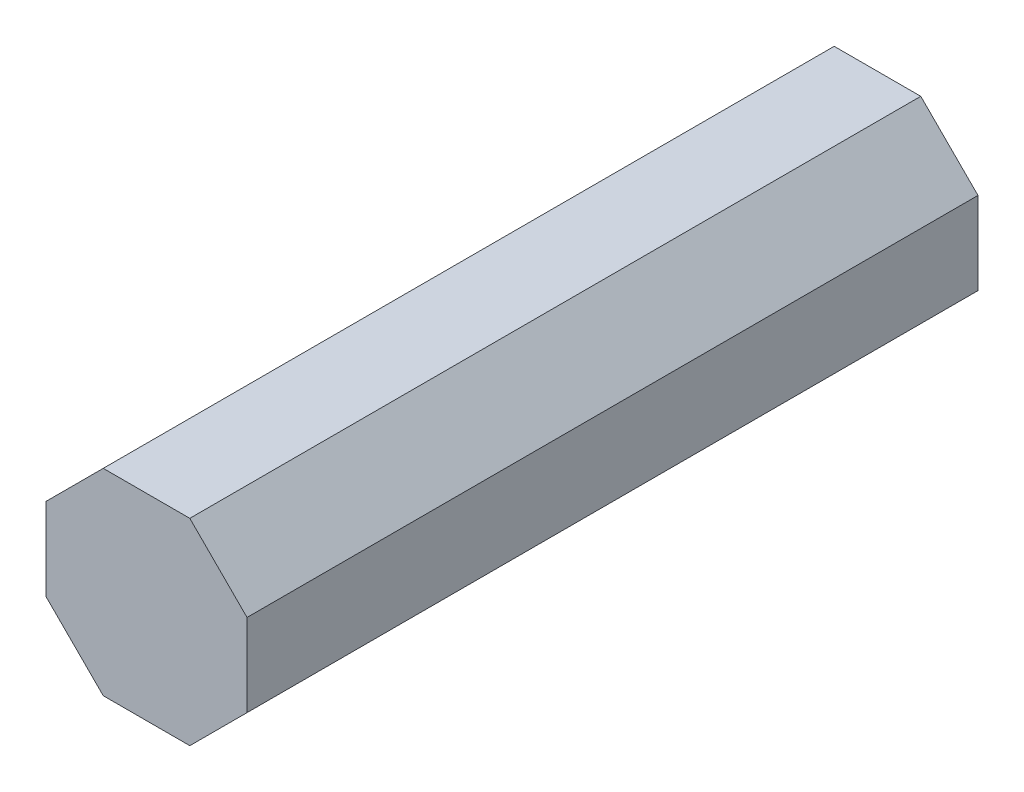
ISO-10303-21;
HEADER;
FILE_DESCRIPTION(('STEP AP214'),'2;1');
FILE_NAME('part.step','',(''),(''),'','','');
FILE_SCHEMA(('AUTOMOTIVE_DESIGN { 1 0 10303 214 1 1 1 1 }'));
ENDSEC;
DATA;
#1=APPLICATION_CONTEXT('core data for automotive mechanical design processes');
#2=APPLICATION_PROTOCOL_DEFINITION('international standard','automotive_design',2000,#1);
#3=PRODUCT_CONTEXT('',#1,'mechanical');
#4=PRODUCT('Part','Part','',(#3));
#5=PRODUCT_RELATED_PRODUCT_CATEGORY('part','',(#4));
#6=PRODUCT_DEFINITION_FORMATION('','',#4);
#7=PRODUCT_DEFINITION_CONTEXT('part definition',#1,'design');
#8=PRODUCT_DEFINITION('design','',#6,#7);
#9=PRODUCT_DEFINITION_SHAPE('','',#8);
#10=(LENGTH_UNIT() NAMED_UNIT(*) SI_UNIT(.MILLI.,.METRE.));
#11=(NAMED_UNIT(*) PLANE_ANGLE_UNIT() SI_UNIT($,.RADIAN.));
#12=(NAMED_UNIT(*) SI_UNIT($,.STERADIAN.) SOLID_ANGLE_UNIT());
#13=UNCERTAINTY_MEASURE_WITH_UNIT(LENGTH_MEASURE(1.E-05),#10,'distance_accuracy_value','');
#14=(GEOMETRIC_REPRESENTATION_CONTEXT(3) GLOBAL_UNCERTAINTY_ASSIGNED_CONTEXT((#13)) GLOBAL_UNIT_ASSIGNED_CONTEXT((#10,
#11,#12)) REPRESENTATION_CONTEXT('',''));
#15=CARTESIAN_POINT('',(0.,0.,0.));
#16=DIRECTION('',(0.,0.,1.));
#17=DIRECTION('',(1.,0.,0.));
#18=AXIS2_PLACEMENT_3D('',#15,#16,#17);
#19=CARTESIAN_POINT('',(11.8452415876267,-26.7531788144406,200.));
#20=DIRECTION('',(0.,1.,0.));
#21=DIRECTION('',(0.,0.,1.));
#22=AXIS2_PLACEMENT_3D('',#19,#20,#21);
#23=PLANE('',#22);
#24=DIRECTION('',(1.,0.,0.));
#25=VECTOR('',#24,1.);
#26=CARTESIAN_POINT('',(11.8452415876267,-26.7531788144406,0.));
#27=LINE('',#26,#25);
#28=CARTESIAN_POINT('',(-11.8452415876267,-26.7531788144406,0.));
#29=VERTEX_POINT('',#28);
#30=CARTESIAN_POINT('',(11.8452415876267,-26.7531788144406,0.));
#31=VERTEX_POINT('',#30);
#32=EDGE_CURVE('E129',#29,#31,#27,.T.);
#33=ORIENTED_EDGE('',*,*,#32,.T.);
#34=DIRECTION('',(0.,0.,-1.));
#35=VECTOR('',#34,1.);
#36=CARTESIAN_POINT('',(11.8452415876267,-26.7531788144406,200.));
#37=LINE('',#36,#35);
#38=CARTESIAN_POINT('',(11.8452415876267,-26.7531788144406,200.));
#39=VERTEX_POINT('',#38);
#40=EDGE_CURVE('E11',#39,#31,#37,.T.);
#41=ORIENTED_EDGE('',*,*,#40,.F.);
#42=DIRECTION('',(1.,0.,0.));
#43=VECTOR('',#42,1.);
#44=CARTESIAN_POINT('',(11.8452415876267,-26.7531788144406,200.));
#45=LINE('',#44,#43);
#46=CARTESIAN_POINT('',(-11.8452415876267,-26.7531788144406,200.));
#47=VERTEX_POINT('',#46);
#48=EDGE_CURVE('E143',#47,#39,#45,.T.);
#49=ORIENTED_EDGE('',*,*,#48,.F.);
#50=DIRECTION('',(0.,0.,-1.));
#51=VECTOR('',#50,1.);
#52=CARTESIAN_POINT('',(-11.8452415876267,-26.7531788144406,200.));
#53=LINE('',#52,#51);
#54=EDGE_CURVE('E125',#47,#29,#53,.T.);
#55=ORIENTED_EDGE('',*,*,#54,.T.);
#56=EDGE_LOOP('',(#33,#41,#49,#55));
#57=FACE_BOUND('',#56,.T.);
#58=ADVANCED_FACE('F33',(#57),#23,.F.);
#59=CARTESIAN_POINT('',(27.5021269428331,-11.0962934592337,200.));
#60=DIRECTION('',(-0.707106781186556,0.707106781186539,0.));
#61=DIRECTION('',(-0.707106781186539,-0.707106781186556,0.));
#62=AXIS2_PLACEMENT_3D('',#59,#60,#61);
#63=PLANE('',#62);
#64=DIRECTION('',(0.707106781186539,0.707106781186556,0.));
#65=VECTOR('',#64,1.);
#66=CARTESIAN_POINT('',(27.5021269428331,-11.0962934592337,0.));
#67=LINE('',#66,#65);
#68=CARTESIAN_POINT('',(27.5021269428331,-11.0962934592337,0.));
#69=VERTEX_POINT('',#68);
#70=EDGE_CURVE('E132',#31,#69,#67,.T.);
#71=ORIENTED_EDGE('',*,*,#70,.T.);
#72=DIRECTION('',(0.,0.,-1.));
#73=VECTOR('',#72,1.);
#74=CARTESIAN_POINT('',(27.5021269428331,-11.0962934592337,200.));
#75=LINE('',#74,#73);
#76=CARTESIAN_POINT('',(27.5021269428331,-11.0962934592337,200.));
#77=VERTEX_POINT('',#76);
#78=EDGE_CURVE('E41',#77,#69,#75,.T.);
#79=ORIENTED_EDGE('',*,*,#78,.F.);
#80=DIRECTION('',(0.707106781186539,0.707106781186556,0.));
#81=VECTOR('',#80,1.);
#82=CARTESIAN_POINT('',(27.5021269428331,-11.0962934592337,200.));
#83=LINE('',#82,#81);
#84=EDGE_CURVE('E92',#39,#77,#83,.T.);
#85=ORIENTED_EDGE('',*,*,#84,.F.);
#86=ORIENTED_EDGE('',*,*,#40,.T.);
#87=EDGE_LOOP('',(#71,#79,#85,#86));
#88=FACE_BOUND('',#87,.T.);
#89=ADVANCED_FACE('F178',(#88),#63,.F.);
#90=CARTESIAN_POINT('',(27.5021269428331,11.4646345570679,200.));
#91=DIRECTION('',(-1.,0.,0.));
#92=DIRECTION('',(0.,0.,1.));
#93=AXIS2_PLACEMENT_3D('',#90,#91,#92);
#94=PLANE('',#93);
#95=DIRECTION('',(0.,1.,0.));
#96=VECTOR('',#95,1.);
#97=CARTESIAN_POINT('',(27.5021269428331,11.4646345570679,0.));
#98=LINE('',#97,#96);
#99=CARTESIAN_POINT('',(27.5021269428331,11.4646345570679,0.));
#100=VERTEX_POINT('',#99);
#101=EDGE_CURVE('E134',#69,#100,#98,.T.);
#102=ORIENTED_EDGE('',*,*,#101,.T.);
#103=DIRECTION('',(0.,0.,-1.));
#104=VECTOR('',#103,1.);
#105=CARTESIAN_POINT('',(27.5021269428331,11.4646345570679,200.));
#106=LINE('',#105,#104);
#107=CARTESIAN_POINT('',(27.5021269428331,11.4646345570679,200.));
#108=VERTEX_POINT('',#107);
#109=EDGE_CURVE('E150',#108,#100,#106,.T.);
#110=ORIENTED_EDGE('',*,*,#109,.F.);
#111=DIRECTION('',(0.,1.,0.));
#112=VECTOR('',#111,1.);
#113=CARTESIAN_POINT('',(27.5021269428331,11.4646345570679,200.));
#114=LINE('',#113,#112);
#115=EDGE_CURVE('E158',#77,#108,#114,.T.);
#116=ORIENTED_EDGE('',*,*,#115,.F.);
#117=ORIENTED_EDGE('',*,*,#78,.T.);
#118=EDGE_LOOP('',(#102,#110,#116,#117));
#119=FACE_BOUND('',#118,.T.);
#120=ADVANCED_FACE('F156',(#119),#94,.F.);
#121=CARTESIAN_POINT('',(11.8452415876267,27.1215199122744,200.));
#122=DIRECTION('',(-0.707106781186547,-0.707106781186547,0.));
#123=DIRECTION('',(0.707106781186548,-0.707106781186548,0.));
#124=AXIS2_PLACEMENT_3D('',#121,#122,#123);
#125=PLANE('',#124);
#126=DIRECTION('',(-0.707106781186547,0.707106781186547,0.));
#127=VECTOR('',#126,1.);
#128=CARTESIAN_POINT('',(11.8452415876267,27.1215199122744,0.));
#129=LINE('',#128,#127);
#130=CARTESIAN_POINT('',(11.8452415876267,27.1215199122744,0.));
#131=VERTEX_POINT('',#130);
#132=EDGE_CURVE('E136',#100,#131,#129,.T.);
#133=ORIENTED_EDGE('',*,*,#132,.T.);
#134=DIRECTION('',(0.,0.,-1.));
#135=VECTOR('',#134,1.);
#136=CARTESIAN_POINT('',(11.8452415876267,27.1215199122744,200.));
#137=LINE('',#136,#135);
#138=CARTESIAN_POINT('',(11.8452415876267,27.1215199122744,200.));
#139=VERTEX_POINT('',#138);
#140=EDGE_CURVE('E147',#139,#131,#137,.T.);
#141=ORIENTED_EDGE('',*,*,#140,.F.);
#142=DIRECTION('',(-0.707106781186547,0.707106781186547,0.));
#143=VECTOR('',#142,1.);
#144=CARTESIAN_POINT('',(11.8452415876267,27.1215199122744,200.));
#145=LINE('',#144,#143);
#146=EDGE_CURVE('E170',#108,#139,#145,.T.);
#147=ORIENTED_EDGE('',*,*,#146,.F.);
#148=ORIENTED_EDGE('',*,*,#109,.T.);
#149=EDGE_LOOP('',(#133,#141,#147,#148));
#150=FACE_BOUND('',#149,.T.);
#151=ADVANCED_FACE('F166',(#150),#125,.F.);
#152=CARTESIAN_POINT('',(-11.8452415876267,27.1215199122744,200.));
#153=DIRECTION('',(0.,-1.,0.));
#154=DIRECTION('',(0.,0.,-1.));
#155=AXIS2_PLACEMENT_3D('',#152,#153,#154);
#156=PLANE('',#155);
#157=DIRECTION('',(-1.,0.,0.));
#158=VECTOR('',#157,1.);
#159=CARTESIAN_POINT('',(-11.8452415876267,27.1215199122744,0.));
#160=LINE('',#159,#158);
#161=CARTESIAN_POINT('',(-11.8452415876267,27.1215199122744,0.));
#162=VERTEX_POINT('',#161);
#163=EDGE_CURVE('E138',#131,#162,#160,.T.);
#164=ORIENTED_EDGE('',*,*,#163,.T.);
#165=DIRECTION('',(0.,0.,-1.));
#166=VECTOR('',#165,1.);
#167=CARTESIAN_POINT('',(-11.8452415876267,27.1215199122744,200.));
#168=LINE('',#167,#166);
#169=CARTESIAN_POINT('',(-11.8452415876267,27.1215199122744,200.));
#170=VERTEX_POINT('',#169);
#171=EDGE_CURVE('E120',#170,#162,#168,.T.);
#172=ORIENTED_EDGE('',*,*,#171,.F.);
#173=DIRECTION('',(-1.,0.,0.));
#174=VECTOR('',#173,1.);
#175=CARTESIAN_POINT('',(-11.8452415876267,27.1215199122744,200.));
#176=LINE('',#175,#174);
#177=EDGE_CURVE('E111',#139,#170,#176,.T.);
#178=ORIENTED_EDGE('',*,*,#177,.F.);
#179=ORIENTED_EDGE('',*,*,#140,.T.);
#180=EDGE_LOOP('',(#164,#172,#178,#179));
#181=FACE_BOUND('',#180,.T.);
#182=ADVANCED_FACE('F169',(#181),#156,.F.);
#183=CARTESIAN_POINT('',(-11.8452415876267,27.1215199122744,200.));
#184=DIRECTION('',(0.707106781186547,-0.707106781186547,0.));
#185=DIRECTION('',(0.707106781186548,0.707106781186548,0.));
#186=AXIS2_PLACEMENT_3D('',#183,#184,#185);
#187=PLANE('',#186);
#188=DIRECTION('',(-0.707106781186547,-0.707106781186547,0.));
#189=VECTOR('',#188,1.);
#190=CARTESIAN_POINT('',(-11.8452415876267,27.1215199122744,0.));
#191=LINE('',#190,#189);
#192=CARTESIAN_POINT('',(-27.5021269428331,11.4646345570679,0.));
#193=VERTEX_POINT('',#192);
#194=EDGE_CURVE('E119',#162,#193,#191,.T.);
#195=ORIENTED_EDGE('',*,*,#194,.T.);
#196=DIRECTION('',(0.,0.,-1.));
#197=VECTOR('',#196,1.);
#198=CARTESIAN_POINT('',(-27.5021269428331,11.4646345570679,200.));
#199=LINE('',#198,#197);
#200=CARTESIAN_POINT('',(-27.5021269428331,11.4646345570679,200.));
#201=VERTEX_POINT('',#200);
#202=EDGE_CURVE('E116',#201,#193,#199,.T.);
#203=ORIENTED_EDGE('',*,*,#202,.F.);
#204=DIRECTION('',(-0.707106781186547,-0.707106781186547,0.));
#205=VECTOR('',#204,1.);
#206=CARTESIAN_POINT('',(-11.8452415876267,27.1215199122744,200.));
#207=LINE('',#206,#205);
#208=EDGE_CURVE('E105',#170,#201,#207,.T.);
#209=ORIENTED_EDGE('',*,*,#208,.F.);
#210=ORIENTED_EDGE('',*,*,#171,.T.);
#211=EDGE_LOOP('',(#195,#203,#209,#210));
#212=FACE_BOUND('',#211,.T.);
#213=ADVANCED_FACE('F117',(#212),#187,.F.);
#214=CARTESIAN_POINT('',(-27.5021269428331,11.4646345570679,200.));
#215=DIRECTION('',(1.,0.,0.));
#216=DIRECTION('',(0.,0.,-1.));
#217=AXIS2_PLACEMENT_3D('',#214,#215,#216);
#218=PLANE('',#217);
#219=DIRECTION('',(0.,-1.,0.));
#220=VECTOR('',#219,1.);
#221=CARTESIAN_POINT('',(-27.5021269428331,11.4646345570679,0.));
#222=LINE('',#221,#220);
#223=CARTESIAN_POINT('',(-27.5021269428331,-11.0962934592337,0.));
#224=VERTEX_POINT('',#223);
#225=EDGE_CURVE('E78',#193,#224,#222,.T.);
#226=ORIENTED_EDGE('',*,*,#225,.T.);
#227=DIRECTION('',(0.,0.,-1.));
#228=VECTOR('',#227,1.);
#229=CARTESIAN_POINT('',(-27.5021269428331,-11.0962934592337,200.));
#230=LINE('',#229,#228);
#231=CARTESIAN_POINT('',(-27.5021269428331,-11.0962934592337,200.));
#232=VERTEX_POINT('',#231);
#233=EDGE_CURVE('E121',#232,#224,#230,.T.);
#234=ORIENTED_EDGE('',*,*,#233,.F.);
#235=DIRECTION('',(0.,-1.,0.));
#236=VECTOR('',#235,1.);
#237=CARTESIAN_POINT('',(-27.5021269428331,11.4646345570679,200.));
#238=LINE('',#237,#236);
#239=EDGE_CURVE('E109',#201,#232,#238,.T.);
#240=ORIENTED_EDGE('',*,*,#239,.F.);
#241=ORIENTED_EDGE('',*,*,#202,.T.);
#242=EDGE_LOOP('',(#226,#234,#240,#241));
#243=FACE_BOUND('',#242,.T.);
#244=ADVANCED_FACE('F123',(#243),#218,.F.);
#245=CARTESIAN_POINT('',(-27.5021269428331,-11.0962934592337,200.));
#246=DIRECTION('',(0.707106781186556,0.707106781186539,0.));
#247=DIRECTION('',(-0.707106781186539,0.707106781186556,0.));
#248=AXIS2_PLACEMENT_3D('',#245,#246,#247);
#249=PLANE('',#248);
#250=DIRECTION('',(0.707106781186539,-0.707106781186556,0.));
#251=VECTOR('',#250,1.);
#252=CARTESIAN_POINT('',(-27.5021269428331,-11.0962934592337,0.));
#253=LINE('',#252,#251);
#254=EDGE_CURVE('E84',#224,#29,#253,.T.);
#255=ORIENTED_EDGE('',*,*,#254,.T.);
#256=ORIENTED_EDGE('',*,*,#54,.F.);
#257=DIRECTION('',(0.707106781186539,-0.707106781186556,0.));
#258=VECTOR('',#257,1.);
#259=CARTESIAN_POINT('',(-27.5021269428331,-11.0962934592337,200.));
#260=LINE('',#259,#258);
#261=EDGE_CURVE('E49',#232,#47,#260,.T.);
#262=ORIENTED_EDGE('',*,*,#261,.F.);
#263=ORIENTED_EDGE('',*,*,#233,.T.);
#264=EDGE_LOOP('',(#255,#256,#262,#263));
#265=FACE_BOUND('',#264,.T.);
#266=ADVANCED_FACE('F194',(#265),#249,.F.);
#267=CARTESIAN_POINT('',(0.,0.,200.));
#268=DIRECTION('',(0.,0.,1.));
#269=DIRECTION('',(1.,0.,0.));
#270=AXIS2_PLACEMENT_3D('',#267,#268,#269);
#271=PLANE('',#270);
#272=ORIENTED_EDGE('',*,*,#48,.T.);
#273=ORIENTED_EDGE('',*,*,#84,.T.);
#274=ORIENTED_EDGE('',*,*,#115,.T.);
#275=ORIENTED_EDGE('',*,*,#146,.T.);
#276=ORIENTED_EDGE('',*,*,#177,.T.);
#277=ORIENTED_EDGE('',*,*,#208,.T.);
#278=ORIENTED_EDGE('',*,*,#239,.T.);
#279=ORIENTED_EDGE('',*,*,#261,.T.);
#280=EDGE_LOOP('',(#272,#273,#274,#275,#276,#277,#278,#279));
#281=FACE_BOUND('',#280,.T.);
#282=ADVANCED_FACE('F107',(#281),#271,.T.);
#283=CARTESIAN_POINT('',(0.,0.,0.));
#284=DIRECTION('',(0.,0.,1.));
#285=DIRECTION('',(1.,0.,0.));
#286=AXIS2_PLACEMENT_3D('',#283,#284,#285);
#287=PLANE('',#286);
#288=ORIENTED_EDGE('',*,*,#32,.F.);
#289=ORIENTED_EDGE('',*,*,#254,.F.);
#290=ORIENTED_EDGE('',*,*,#225,.F.);
#291=ORIENTED_EDGE('',*,*,#194,.F.);
#292=ORIENTED_EDGE('',*,*,#163,.F.);
#293=ORIENTED_EDGE('',*,*,#132,.F.);
#294=ORIENTED_EDGE('',*,*,#101,.F.);
#295=ORIENTED_EDGE('',*,*,#70,.F.);
#296=EDGE_LOOP('',(#288,#289,#290,#291,#292,#293,#294,#295));
#297=FACE_BOUND('',#296,.T.);
#298=ADVANCED_FACE('F162',(#297),#287,.F.);
#299=CLOSED_SHELL('',(#58,#89,#120,#151,#182,#213,#244,#266,#282,#298));
#300=MANIFOLD_SOLID_BREP('B2',#299);
#301=ADVANCED_BREP_SHAPE_REPRESENTATION('',(#18,#300),#14);
#302=SHAPE_DEFINITION_REPRESENTATION(#9,#301);
ENDSEC;
END-ISO-10303-21;
